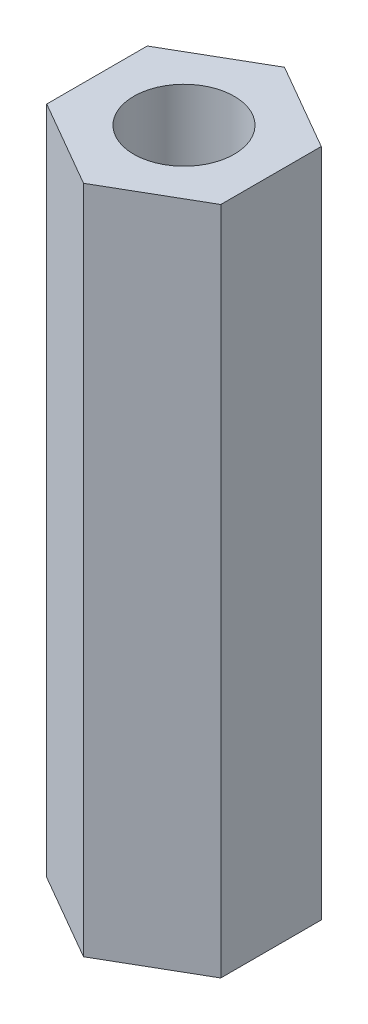
ISO-10303-21;
HEADER;
FILE_DESCRIPTION(('STEP AP214'),'2;1');
FILE_NAME('part.step','',(''),(''),'','','');
FILE_SCHEMA(('AUTOMOTIVE_DESIGN { 1 0 10303 214 1 1 1 1 }'));
ENDSEC;
DATA;
#1=APPLICATION_CONTEXT('core data for automotive mechanical design processes');
#2=APPLICATION_PROTOCOL_DEFINITION('international standard','automotive_design',2000,#1);
#3=PRODUCT_CONTEXT('',#1,'mechanical');
#4=PRODUCT('Part','Part','',(#3));
#5=PRODUCT_RELATED_PRODUCT_CATEGORY('part','',(#4));
#6=PRODUCT_DEFINITION_FORMATION('','',#4);
#7=PRODUCT_DEFINITION_CONTEXT('part definition',#1,'design');
#8=PRODUCT_DEFINITION('design','',#6,#7);
#9=PRODUCT_DEFINITION_SHAPE('','',#8);
#10=(LENGTH_UNIT() NAMED_UNIT(*) SI_UNIT(.MILLI.,.METRE.));
#11=(NAMED_UNIT(*) PLANE_ANGLE_UNIT() SI_UNIT($,.RADIAN.));
#12=(NAMED_UNIT(*) SI_UNIT($,.STERADIAN.) SOLID_ANGLE_UNIT());
#13=UNCERTAINTY_MEASURE_WITH_UNIT(LENGTH_MEASURE(1.E-05),#10,'distance_accuracy_value','');
#14=(GEOMETRIC_REPRESENTATION_CONTEXT(3) GLOBAL_UNCERTAINTY_ASSIGNED_CONTEXT((#13)) GLOBAL_UNIT_ASSIGNED_CONTEXT((#10,
#11,#12)) REPRESENTATION_CONTEXT('',''));
#15=CARTESIAN_POINT('',(0.,0.,0.));
#16=DIRECTION('',(0.,0.,1.));
#17=DIRECTION('',(1.,0.,0.));
#18=AXIS2_PLACEMENT_3D('',#15,#16,#17);
#19=CARTESIAN_POINT('',(0.,20.,0.));
#20=DIRECTION('',(0.,1.,0.));
#21=DIRECTION('',(0.,0.,1.));
#22=AXIS2_PLACEMENT_3D('',#19,#20,#21);
#23=PLANE('',#22);
#24=DIRECTION('',(-0.866025403784439,0.,-0.499999999999999));
#25=VECTOR('',#24,1.);
#26=CARTESIAN_POINT('',(2.59807621135331,20.,-1.50000000000001));
#27=LINE('',#26,#25);
#28=CARTESIAN_POINT('',(2.59807621135331,20.,-1.50000000000001));
#29=VERTEX_POINT('',#28);
#30=CARTESIAN_POINT('',(0.,20.,-3.));
#31=VERTEX_POINT('',#30);
#32=EDGE_CURVE('E130',#29,#31,#27,.T.);
#33=ORIENTED_EDGE('',*,*,#32,.T.);
#34=DIRECTION('',(-0.866025403784439,0.,0.499999999999999));
#35=VECTOR('',#34,1.);
#36=CARTESIAN_POINT('',(0.,20.,-3.));
#37=LINE('',#36,#35);
#38=CARTESIAN_POINT('',(-2.59807621135331,20.,-1.5));
#39=VERTEX_POINT('',#38);
#40=EDGE_CURVE('E88',#31,#39,#37,.T.);
#41=ORIENTED_EDGE('',*,*,#40,.T.);
#42=DIRECTION('',(0.,0.,1.));
#43=VECTOR('',#42,1.);
#44=CARTESIAN_POINT('',(-2.59807621135331,20.,-1.5));
#45=LINE('',#44,#43);
#46=CARTESIAN_POINT('',(-2.59807621135331,20.,1.50000000000001));
#47=VERTEX_POINT('',#46);
#48=EDGE_CURVE('E101',#39,#47,#45,.T.);
#49=ORIENTED_EDGE('',*,*,#48,.T.);
#50=DIRECTION('',(0.866025403784439,0.,0.499999999999999));
#51=VECTOR('',#50,1.);
#52=CARTESIAN_POINT('',(-2.59807621135331,20.,1.50000000000001));
#53=LINE('',#52,#51);
#54=CARTESIAN_POINT('',(0.,20.,3.));
#55=VERTEX_POINT('',#54);
#56=EDGE_CURVE('E95',#47,#55,#53,.T.);
#57=ORIENTED_EDGE('',*,*,#56,.T.);
#58=DIRECTION('',(0.866025403784439,0.,-0.499999999999999));
#59=VECTOR('',#58,1.);
#60=CARTESIAN_POINT('',(0.,20.,3.));
#61=LINE('',#60,#59);
#62=CARTESIAN_POINT('',(2.59807621135331,20.,1.5));
#63=VERTEX_POINT('',#62);
#64=EDGE_CURVE('E99',#55,#63,#61,.T.);
#65=ORIENTED_EDGE('',*,*,#64,.T.);
#66=DIRECTION('',(0.,0.,-1.));
#67=VECTOR('',#66,1.);
#68=CARTESIAN_POINT('',(2.59807621135331,20.,1.5));
#69=LINE('',#68,#67);
#70=EDGE_CURVE('E51',#63,#29,#69,.T.);
#71=ORIENTED_EDGE('',*,*,#70,.T.);
#72=EDGE_LOOP('',(#33,#41,#49,#57,#65,#71));
#73=FACE_BOUND('',#72,.T.);
#74=CARTESIAN_POINT('',(0.,20.,0.));
#75=DIRECTION('',(0.,1.,0.));
#76=DIRECTION('',(0.,0.,1.));
#77=AXIS2_PLACEMENT_3D('',#74,#75,#76);
#78=CIRCLE('',#77,1.5);
#79=CARTESIAN_POINT('',(0.,20.,1.5));
#80=VERTEX_POINT('',#79);
#81=EDGE_CURVE('E123',#80,#80,#78,.T.);
#82=ORIENTED_EDGE('',*,*,#81,.F.);
#83=EDGE_LOOP('',(#82));
#84=FACE_BOUND('',#83,.T.);
#85=ADVANCED_FACE('F34',(#73,#84),#23,.T.);
#86=CARTESIAN_POINT('',(0.,0.,0.));
#87=DIRECTION('',(0.,1.,0.));
#88=DIRECTION('',(0.,0.,1.));
#89=AXIS2_PLACEMENT_3D('',#86,#87,#88);
#90=PLANE('',#89);
#91=DIRECTION('',(-0.866025403784439,0.,-0.499999999999999));
#92=VECTOR('',#91,1.);
#93=CARTESIAN_POINT('',(2.59807621135331,0.,-1.50000000000001));
#94=LINE('',#93,#92);
#95=CARTESIAN_POINT('',(2.59807621135331,0.,-1.50000000000001));
#96=VERTEX_POINT('',#95);
#97=CARTESIAN_POINT('',(0.,0.,-3.));
#98=VERTEX_POINT('',#97);
#99=EDGE_CURVE('E119',#96,#98,#94,.T.);
#100=ORIENTED_EDGE('',*,*,#99,.F.);
#101=DIRECTION('',(0.,0.,-1.));
#102=VECTOR('',#101,1.);
#103=CARTESIAN_POINT('',(2.59807621135331,0.,1.5));
#104=LINE('',#103,#102);
#105=CARTESIAN_POINT('',(2.59807621135331,0.,1.5));
#106=VERTEX_POINT('',#105);
#107=EDGE_CURVE('E80',#106,#96,#104,.T.);
#108=ORIENTED_EDGE('',*,*,#107,.F.);
#109=DIRECTION('',(0.866025403784439,0.,-0.499999999999999));
#110=VECTOR('',#109,1.);
#111=CARTESIAN_POINT('',(0.,0.,3.));
#112=LINE('',#111,#110);
#113=CARTESIAN_POINT('',(0.,0.,3.));
#114=VERTEX_POINT('',#113);
#115=EDGE_CURVE('E74',#114,#106,#112,.T.);
#116=ORIENTED_EDGE('',*,*,#115,.F.);
#117=DIRECTION('',(0.866025403784439,0.,0.499999999999999));
#118=VECTOR('',#117,1.);
#119=CARTESIAN_POINT('',(-2.59807621135331,0.,1.50000000000001));
#120=LINE('',#119,#118);
#121=CARTESIAN_POINT('',(-2.59807621135331,0.,1.50000000000001));
#122=VERTEX_POINT('',#121);
#123=EDGE_CURVE('E109',#122,#114,#120,.T.);
#124=ORIENTED_EDGE('',*,*,#123,.F.);
#125=DIRECTION('',(0.,0.,1.));
#126=VECTOR('',#125,1.);
#127=CARTESIAN_POINT('',(-2.59807621135331,0.,-1.5));
#128=LINE('',#127,#126);
#129=CARTESIAN_POINT('',(-2.59807621135331,0.,-1.5));
#130=VERTEX_POINT('',#129);
#131=EDGE_CURVE('E125',#130,#122,#128,.T.);
#132=ORIENTED_EDGE('',*,*,#131,.F.);
#133=DIRECTION('',(-0.866025403784439,0.,0.499999999999999));
#134=VECTOR('',#133,1.);
#135=CARTESIAN_POINT('',(0.,0.,-3.));
#136=LINE('',#135,#134);
#137=EDGE_CURVE('E122',#98,#130,#136,.T.);
#138=ORIENTED_EDGE('',*,*,#137,.F.);
#139=EDGE_LOOP('',(#100,#108,#116,#124,#132,#138));
#140=FACE_BOUND('',#139,.T.);
#141=CARTESIAN_POINT('',(0.,0.,0.));
#142=DIRECTION('',(0.,1.,0.));
#143=DIRECTION('',(0.,0.,1.));
#144=AXIS2_PLACEMENT_3D('',#141,#142,#143);
#145=CIRCLE('',#144,1.5);
#146=CARTESIAN_POINT('',(0.,0.,1.5));
#147=VERTEX_POINT('',#146);
#148=EDGE_CURVE('E223',#147,#147,#145,.T.);
#149=ORIENTED_EDGE('',*,*,#148,.T.);
#150=EDGE_LOOP('',(#149));
#151=FACE_BOUND('',#150,.T.);
#152=ADVANCED_FACE('F139',(#140,#151),#90,.F.);
#153=CARTESIAN_POINT('',(2.59807621135331,20.,-1.50000000000001));
#154=DIRECTION('',(-0.499999999999999,0.,0.866025403784439));
#155=DIRECTION('',(0.866025403784439,0.,0.499999999999999));
#156=AXIS2_PLACEMENT_3D('',#153,#154,#155);
#157=PLANE('',#156);
#158=ORIENTED_EDGE('',*,*,#99,.T.);
#159=DIRECTION('',(0.,-1.,0.));
#160=VECTOR('',#159,1.);
#161=CARTESIAN_POINT('',(0.,20.,-3.));
#162=LINE('',#161,#160);
#163=EDGE_CURVE('E11',#31,#98,#162,.T.);
#164=ORIENTED_EDGE('',*,*,#163,.F.);
#165=ORIENTED_EDGE('',*,*,#32,.F.);
#166=DIRECTION('',(0.,-1.,0.));
#167=VECTOR('',#166,1.);
#168=CARTESIAN_POINT('',(2.59807621135331,20.,-1.50000000000001));
#169=LINE('',#168,#167);
#170=EDGE_CURVE('E115',#29,#96,#169,.T.);
#171=ORIENTED_EDGE('',*,*,#170,.T.);
#172=EDGE_LOOP('',(#158,#164,#165,#171));
#173=FACE_BOUND('',#172,.T.);
#174=ADVANCED_FACE('F36',(#173),#157,.F.);
#175=CARTESIAN_POINT('',(0.,20.,-3.));
#176=DIRECTION('',(0.499999999999999,0.,0.866025403784439));
#177=DIRECTION('',(0.866025403784439,0.,-0.499999999999999));
#178=AXIS2_PLACEMENT_3D('',#175,#176,#177);
#179=PLANE('',#178);
#180=ORIENTED_EDGE('',*,*,#137,.T.);
#181=DIRECTION('',(0.,-1.,0.));
#182=VECTOR('',#181,1.);
#183=CARTESIAN_POINT('',(-2.59807621135331,20.,-1.5));
#184=LINE('',#183,#182);
#185=EDGE_CURVE('E43',#39,#130,#184,.T.);
#186=ORIENTED_EDGE('',*,*,#185,.F.);
#187=ORIENTED_EDGE('',*,*,#40,.F.);
#188=ORIENTED_EDGE('',*,*,#163,.T.);
#189=EDGE_LOOP('',(#180,#186,#187,#188));
#190=FACE_BOUND('',#189,.T.);
#191=ADVANCED_FACE('F164',(#190),#179,.F.);
#192=CARTESIAN_POINT('',(-2.59807621135331,20.,-1.5));
#193=DIRECTION('',(1.,0.,0.));
#194=DIRECTION('',(0.,0.,-1.));
#195=AXIS2_PLACEMENT_3D('',#192,#193,#194);
#196=PLANE('',#195);
#197=ORIENTED_EDGE('',*,*,#131,.T.);
#198=DIRECTION('',(0.,-1.,0.));
#199=VECTOR('',#198,1.);
#200=CARTESIAN_POINT('',(-2.59807621135331,20.,1.50000000000001));
#201=LINE('',#200,#199);
#202=EDGE_CURVE('E110',#47,#122,#201,.T.);
#203=ORIENTED_EDGE('',*,*,#202,.F.);
#204=ORIENTED_EDGE('',*,*,#48,.F.);
#205=ORIENTED_EDGE('',*,*,#185,.T.);
#206=EDGE_LOOP('',(#197,#203,#204,#205));
#207=FACE_BOUND('',#206,.T.);
#208=ADVANCED_FACE('F136',(#207),#196,.F.);
#209=CARTESIAN_POINT('',(-2.59807621135331,20.,1.50000000000001));
#210=DIRECTION('',(0.499999999999999,0.,-0.866025403784439));
#211=DIRECTION('',(-0.866025403784439,0.,-0.499999999999999));
#212=AXIS2_PLACEMENT_3D('',#209,#210,#211);
#213=PLANE('',#212);
#214=ORIENTED_EDGE('',*,*,#123,.T.);
#215=DIRECTION('',(0.,-1.,0.));
#216=VECTOR('',#215,1.);
#217=CARTESIAN_POINT('',(0.,20.,3.));
#218=LINE('',#217,#216);
#219=EDGE_CURVE('E106',#55,#114,#218,.T.);
#220=ORIENTED_EDGE('',*,*,#219,.F.);
#221=ORIENTED_EDGE('',*,*,#56,.F.);
#222=ORIENTED_EDGE('',*,*,#202,.T.);
#223=EDGE_LOOP('',(#214,#220,#221,#222));
#224=FACE_BOUND('',#223,.T.);
#225=ADVANCED_FACE('F107',(#224),#213,.F.);
#226=CARTESIAN_POINT('',(0.,20.,3.));
#227=DIRECTION('',(-0.499999999999999,0.,-0.866025403784439));
#228=DIRECTION('',(-0.866025403784439,0.,0.499999999999999));
#229=AXIS2_PLACEMENT_3D('',#226,#227,#228);
#230=PLANE('',#229);
#231=ORIENTED_EDGE('',*,*,#115,.T.);
#232=DIRECTION('',(0.,-1.,0.));
#233=VECTOR('',#232,1.);
#234=CARTESIAN_POINT('',(2.59807621135331,20.,1.5));
#235=LINE('',#234,#233);
#236=EDGE_CURVE('E111',#63,#106,#235,.T.);
#237=ORIENTED_EDGE('',*,*,#236,.F.);
#238=ORIENTED_EDGE('',*,*,#64,.F.);
#239=ORIENTED_EDGE('',*,*,#219,.T.);
#240=EDGE_LOOP('',(#231,#237,#238,#239));
#241=FACE_BOUND('',#240,.T.);
#242=ADVANCED_FACE('F113',(#241),#230,.F.);
#243=CARTESIAN_POINT('',(2.59807621135331,20.,1.5));
#244=DIRECTION('',(-1.,0.,0.));
#245=DIRECTION('',(0.,0.,1.));
#246=AXIS2_PLACEMENT_3D('',#243,#244,#245);
#247=PLANE('',#246);
#248=ORIENTED_EDGE('',*,*,#107,.T.);
#249=ORIENTED_EDGE('',*,*,#170,.F.);
#250=ORIENTED_EDGE('',*,*,#70,.F.);
#251=ORIENTED_EDGE('',*,*,#236,.T.);
#252=EDGE_LOOP('',(#248,#249,#250,#251));
#253=FACE_BOUND('',#252,.T.);
#254=ADVANCED_FACE('F144',(#253),#247,.F.);
#255=CARTESIAN_POINT('',(0.,20.,0.));
#256=DIRECTION('',(0.,-1.,0.));
#257=DIRECTION('',(0.,0.,-1.));
#258=AXIS2_PLACEMENT_3D('',#255,#256,#257);
#259=CYLINDRICAL_SURFACE('',#258,1.5);
#260=ORIENTED_EDGE('',*,*,#81,.T.);
#261=EDGE_LOOP('',(#260));
#262=FACE_BOUND('',#261,.T.);
#263=ORIENTED_EDGE('',*,*,#148,.F.);
#264=EDGE_LOOP('',(#263));
#265=FACE_BOUND('',#264,.T.);
#266=ADVANCED_FACE('F146',(#262,#265),#259,.F.);
#267=CLOSED_SHELL('',(#85,#152,#174,#191,#208,#225,#242,#254,#266));
#268=MANIFOLD_SOLID_BREP('B2',#267);
#269=ADVANCED_BREP_SHAPE_REPRESENTATION('',(#18,#268),#14);
#270=SHAPE_DEFINITION_REPRESENTATION(#9,#269);
ENDSEC;
END-ISO-10303-21;
